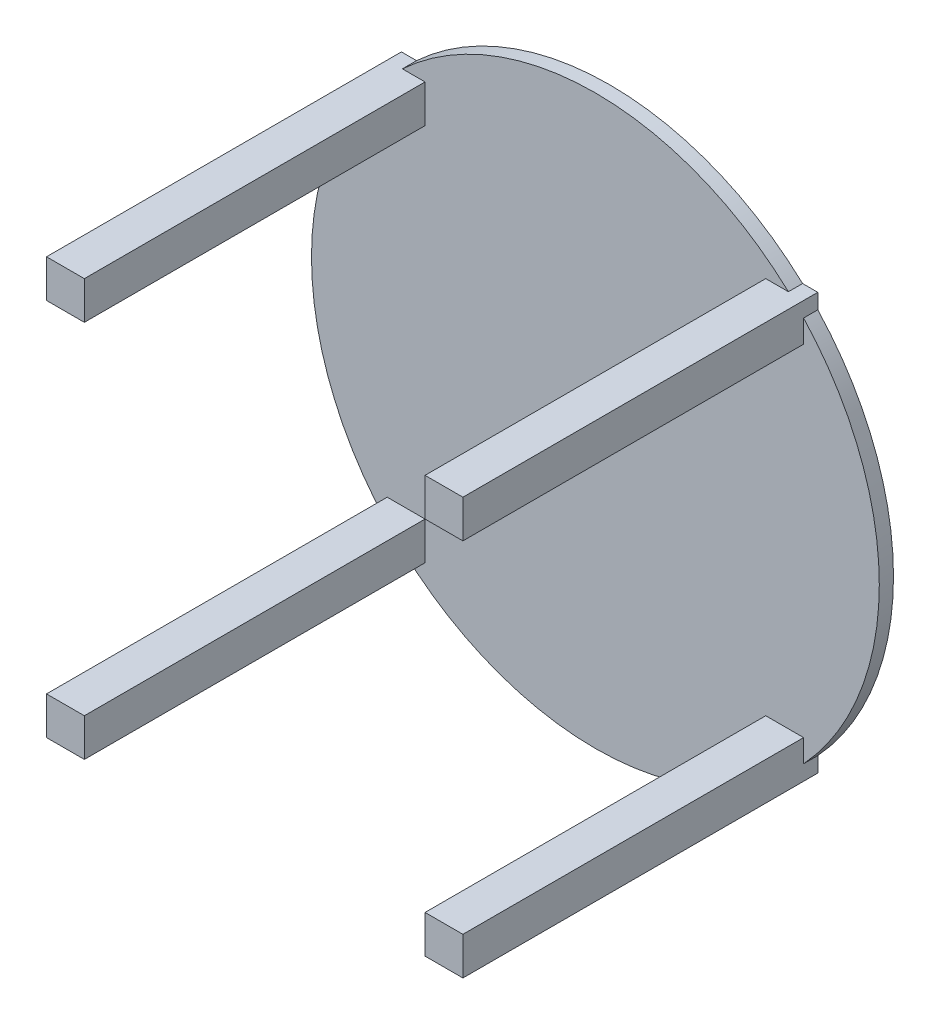
ISO-10303-21;
HEADER;
FILE_DESCRIPTION(('STEP AP214'),'2;1');
FILE_NAME('part.step','',(''),(''),'','','');
FILE_SCHEMA(('AUTOMOTIVE_DESIGN { 1 0 10303 214 1 1 1 1 }'));
ENDSEC;
DATA;
#1=APPLICATION_CONTEXT('core data for automotive mechanical design processes');
#2=APPLICATION_PROTOCOL_DEFINITION('international standard','automotive_design',2000,#1);
#3=PRODUCT_CONTEXT('',#1,'mechanical');
#4=PRODUCT('Part','Part','',(#3));
#5=PRODUCT_RELATED_PRODUCT_CATEGORY('part','',(#4));
#6=PRODUCT_DEFINITION_FORMATION('','',#4);
#7=PRODUCT_DEFINITION_CONTEXT('part definition',#1,'design');
#8=PRODUCT_DEFINITION('design','',#6,#7);
#9=PRODUCT_DEFINITION_SHAPE('','',#8);
#10=(LENGTH_UNIT() NAMED_UNIT(*) SI_UNIT(.MILLI.,.METRE.));
#11=(NAMED_UNIT(*) PLANE_ANGLE_UNIT() SI_UNIT($,.RADIAN.));
#12=(NAMED_UNIT(*) SI_UNIT($,.STERADIAN.) SOLID_ANGLE_UNIT());
#13=UNCERTAINTY_MEASURE_WITH_UNIT(LENGTH_MEASURE(1.E-05),#10,'distance_accuracy_value','');
#14=(GEOMETRIC_REPRESENTATION_CONTEXT(3) GLOBAL_UNCERTAINTY_ASSIGNED_CONTEXT((#13)) GLOBAL_UNIT_ASSIGNED_CONTEXT((#10,
#11,#12)) REPRESENTATION_CONTEXT('',''));
#15=CARTESIAN_POINT('',(0.,0.,0.));
#16=DIRECTION('',(0.,0.,1.));
#17=DIRECTION('',(1.,0.,0.));
#18=AXIS2_PLACEMENT_3D('',#15,#16,#17);
#19=CARTESIAN_POINT('',(0.,0.,30.));
#20=DIRECTION('',(0.,0.,-1.));
#21=DIRECTION('',(-1.,0.,0.));
#22=AXIS2_PLACEMENT_3D('',#19,#20,#21);
#23=CYLINDRICAL_SURFACE('',#22,600.);
#24=DIRECTION('',(0.,0.,-1.));
#25=VECTOR('',#24,1.);
#26=CARTESIAN_POINT('',(440.,407.921561087423,30.));
#27=LINE('',#26,#25);
#28=CARTESIAN_POINT('',(440.,407.921561087423,30.));
#29=VERTEX_POINT('',#28);
#30=CARTESIAN_POINT('',(440.,407.921561087423,0.));
#31=VERTEX_POINT('',#30);
#32=EDGE_CURVE('E247',#29,#31,#27,.T.);
#33=ORIENTED_EDGE('',*,*,#32,.F.);
#34=CARTESIAN_POINT('',(0.,0.,30.));
#35=DIRECTION('',(0.,0.,1.));
#36=DIRECTION('',(1.,0.,0.));
#37=AXIS2_PLACEMENT_3D('',#34,#35,#36);
#38=CIRCLE('',#37,600.);
#39=CARTESIAN_POINT('',(440.,-407.921561087423,30.));
#40=VERTEX_POINT('',#39);
#41=EDGE_CURVE('E49',#40,#29,#38,.T.);
#42=ORIENTED_EDGE('',*,*,#41,.F.);
#43=DIRECTION('',(0.,0.,-1.));
#44=VECTOR('',#43,1.);
#45=CARTESIAN_POINT('',(440.,-407.921561087423,30.));
#46=LINE('',#45,#44);
#47=CARTESIAN_POINT('',(440.,-407.921561087423,0.));
#48=VERTEX_POINT('',#47);
#49=EDGE_CURVE('E327',#48,#40,#46,.F.);
#50=ORIENTED_EDGE('',*,*,#49,.F.);
#51=CARTESIAN_POINT('',(0.,0.,0.));
#52=DIRECTION('',(0.,0.,1.));
#53=DIRECTION('',(1.,0.,0.));
#54=AXIS2_PLACEMENT_3D('',#51,#52,#53);
#55=CIRCLE('',#54,600.);
#56=EDGE_CURVE('E373',#48,#31,#55,.T.);
#57=ORIENTED_EDGE('',*,*,#56,.T.);
#58=EDGE_LOOP('',(#33,#42,#50,#57));
#59=FACE_BOUND('',#58,.T.);
#60=ADVANCED_FACE('F41',(#59),#23,.T.);
#61=DIRECTION('',(0.,0.,-1.));
#62=VECTOR('',#61,1.);
#63=CARTESIAN_POINT('',(407.921561087423,440.,30.));
#64=LINE('',#63,#62);
#65=CARTESIAN_POINT('',(407.921561087423,440.,0.));
#66=VERTEX_POINT('',#65);
#67=CARTESIAN_POINT('',(407.921561087423,440.,30.));
#68=VERTEX_POINT('',#67);
#69=EDGE_CURVE('E242',#66,#68,#64,.F.);
#70=ORIENTED_EDGE('',*,*,#69,.F.);
#71=CARTESIAN_POINT('',(-407.921561087423,440.,0.));
#72=VERTEX_POINT('',#71);
#73=EDGE_CURVE('E372',#66,#72,#55,.T.);
#74=ORIENTED_EDGE('',*,*,#73,.T.);
#75=DIRECTION('',(0.,0.,-1.));
#76=VECTOR('',#75,1.);
#77=CARTESIAN_POINT('',(-407.921561087423,440.,30.));
#78=LINE('',#77,#76);
#79=CARTESIAN_POINT('',(-407.921561087423,440.,30.));
#80=VERTEX_POINT('',#79);
#81=EDGE_CURVE('E283',#80,#72,#78,.T.);
#82=ORIENTED_EDGE('',*,*,#81,.F.);
#83=EDGE_CURVE('E50',#68,#80,#38,.T.);
#84=ORIENTED_EDGE('',*,*,#83,.F.);
#85=EDGE_LOOP('',(#70,#74,#82,#84));
#86=FACE_BOUND('',#85,.T.);
#87=ADVANCED_FACE('F412',(#86),#23,.T.);
#88=CARTESIAN_POINT('',(0.,0.,30.));
#89=DIRECTION('',(0.,0.,1.));
#90=DIRECTION('',(1.,0.,0.));
#91=AXIS2_PLACEMENT_3D('',#88,#89,#90);
#92=PLANE('',#91);
#93=ORIENTED_EDGE('',*,*,#41,.T.);
#94=DIRECTION('',(0.,-1.,0.));
#95=VECTOR('',#94,1.);
#96=CARTESIAN_POINT('',(440.,0.,30.));
#97=LINE('',#96,#95);
#98=CARTESIAN_POINT('',(440.,360.,30.));
#99=VERTEX_POINT('',#98);
#100=EDGE_CURVE('E244',#29,#99,#97,.T.);
#101=ORIENTED_EDGE('',*,*,#100,.T.);
#102=DIRECTION('',(-1.,0.,0.));
#103=VECTOR('',#102,1.);
#104=CARTESIAN_POINT('',(0.,360.,30.));
#105=LINE('',#104,#103);
#106=CARTESIAN_POINT('',(360.,360.,30.));
#107=VERTEX_POINT('',#106);
#108=EDGE_CURVE('E229',#99,#107,#105,.T.);
#109=ORIENTED_EDGE('',*,*,#108,.T.);
#110=DIRECTION('',(0.,1.,0.));
#111=VECTOR('',#110,1.);
#112=CARTESIAN_POINT('',(360.,0.,30.));
#113=LINE('',#112,#111);
#114=CARTESIAN_POINT('',(360.,440.,30.));
#115=VERTEX_POINT('',#114);
#116=EDGE_CURVE('E232',#107,#115,#113,.T.);
#117=ORIENTED_EDGE('',*,*,#116,.T.);
#118=DIRECTION('',(1.,0.,0.));
#119=VECTOR('',#118,1.);
#120=CARTESIAN_POINT('',(0.,440.,30.));
#121=LINE('',#120,#119);
#122=EDGE_CURVE('E239',#115,#68,#121,.T.);
#123=ORIENTED_EDGE('',*,*,#122,.T.);
#124=ORIENTED_EDGE('',*,*,#83,.T.);
#125=DIRECTION('',(1.,0.,0.));
#126=VECTOR('',#125,1.);
#127=CARTESIAN_POINT('',(0.,440.,30.));
#128=LINE('',#127,#126);
#129=CARTESIAN_POINT('',(-360.,440.,30.));
#130=VERTEX_POINT('',#129);
#131=EDGE_CURVE('E280',#80,#130,#128,.T.);
#132=ORIENTED_EDGE('',*,*,#131,.T.);
#133=DIRECTION('',(0.,-1.,0.));
#134=VECTOR('',#133,1.);
#135=CARTESIAN_POINT('',(-360.,0.,30.));
#136=LINE('',#135,#134);
#137=CARTESIAN_POINT('',(-360.,360.,30.));
#138=VERTEX_POINT('',#137);
#139=EDGE_CURVE('E286',#130,#138,#136,.T.);
#140=ORIENTED_EDGE('',*,*,#139,.T.);
#141=DIRECTION('',(-1.,0.,0.));
#142=VECTOR('',#141,1.);
#143=CARTESIAN_POINT('',(0.,360.,30.));
#144=LINE('',#143,#142);
#145=CARTESIAN_POINT('',(-440.,360.,30.));
#146=VERTEX_POINT('',#145);
#147=EDGE_CURVE('E272',#138,#146,#144,.T.);
#148=ORIENTED_EDGE('',*,*,#147,.T.);
#149=DIRECTION('',(0.,1.,0.));
#150=VECTOR('',#149,1.);
#151=CARTESIAN_POINT('',(-440.,0.,30.));
#152=LINE('',#151,#150);
#153=CARTESIAN_POINT('',(-440.,407.921561087423,30.));
#154=VERTEX_POINT('',#153);
#155=EDGE_CURVE('E275',#146,#154,#152,.T.);
#156=ORIENTED_EDGE('',*,*,#155,.T.);
#157=CARTESIAN_POINT('',(-440.,-407.921561087423,30.));
#158=VERTEX_POINT('',#157);
#159=EDGE_CURVE('E384',#154,#158,#38,.T.);
#160=ORIENTED_EDGE('',*,*,#159,.T.);
#161=DIRECTION('',(0.,1.,0.));
#162=VECTOR('',#161,1.);
#163=CARTESIAN_POINT('',(-440.,0.,30.));
#164=LINE('',#163,#162);
#165=CARTESIAN_POINT('',(-440.,-360.,30.));
#166=VERTEX_POINT('',#165);
#167=EDGE_CURVE('E359',#158,#166,#164,.T.);
#168=ORIENTED_EDGE('',*,*,#167,.T.);
#169=DIRECTION('',(1.,0.,0.));
#170=VECTOR('',#169,1.);
#171=CARTESIAN_POINT('',(0.,-360.,30.));
#172=LINE('',#171,#170);
#173=CARTESIAN_POINT('',(-360.,-360.,30.));
#174=VERTEX_POINT('',#173);
#175=EDGE_CURVE('E365',#166,#174,#172,.T.);
#176=ORIENTED_EDGE('',*,*,#175,.T.);
#177=DIRECTION('',(0.,-1.,0.));
#178=VECTOR('',#177,1.);
#179=CARTESIAN_POINT('',(-360.,0.,30.));
#180=LINE('',#179,#178);
#181=CARTESIAN_POINT('',(-360.,-440.,30.));
#182=VERTEX_POINT('',#181);
#183=EDGE_CURVE('E368',#174,#182,#180,.T.);
#184=ORIENTED_EDGE('',*,*,#183,.T.);
#185=DIRECTION('',(-1.,0.,0.));
#186=VECTOR('',#185,1.);
#187=CARTESIAN_POINT('',(0.,-440.,30.));
#188=LINE('',#187,#186);
#189=CARTESIAN_POINT('',(-407.921561087423,-440.,30.));
#190=VERTEX_POINT('',#189);
#191=EDGE_CURVE('E354',#182,#190,#188,.T.);
#192=ORIENTED_EDGE('',*,*,#191,.T.);
#193=CARTESIAN_POINT('',(407.921561087423,-440.,30.));
#194=VERTEX_POINT('',#193);
#195=EDGE_CURVE('E11',#190,#194,#38,.T.);
#196=ORIENTED_EDGE('',*,*,#195,.T.);
#197=DIRECTION('',(-1.,0.,0.));
#198=VECTOR('',#197,1.);
#199=CARTESIAN_POINT('',(0.,-440.,30.));
#200=LINE('',#199,#198);
#201=CARTESIAN_POINT('',(360.,-440.,30.));
#202=VERTEX_POINT('',#201);
#203=EDGE_CURVE('E313',#194,#202,#200,.T.);
#204=ORIENTED_EDGE('',*,*,#203,.T.);
#205=DIRECTION('',(0.,1.,0.));
#206=VECTOR('',#205,1.);
#207=CARTESIAN_POINT('',(360.,0.,30.));
#208=LINE('',#207,#206);
#209=CARTESIAN_POINT('',(360.,-360.,30.));
#210=VERTEX_POINT('',#209);
#211=EDGE_CURVE('E318',#202,#210,#208,.T.);
#212=ORIENTED_EDGE('',*,*,#211,.T.);
#213=DIRECTION('',(1.,0.,0.));
#214=VECTOR('',#213,1.);
#215=CARTESIAN_POINT('',(0.,-360.,30.));
#216=LINE('',#215,#214);
#217=CARTESIAN_POINT('',(440.,-360.,30.));
#218=VERTEX_POINT('',#217);
#219=EDGE_CURVE('E321',#210,#218,#216,.T.);
#220=ORIENTED_EDGE('',*,*,#219,.T.);
#221=DIRECTION('',(0.,-1.,0.));
#222=VECTOR('',#221,1.);
#223=CARTESIAN_POINT('',(440.,0.,30.));
#224=LINE('',#223,#222);
#225=EDGE_CURVE('E324',#218,#40,#224,.T.);
#226=ORIENTED_EDGE('',*,*,#225,.T.);
#227=EDGE_LOOP('',(#93,#101,#109,#117,#123,#124,#132,#140,#148,#156,#160,#168,#176,#184,#192,
#196,#204,#212,#220,#226));
#228=FACE_BOUND('',#227,.T.);
#229=ADVANCED_FACE('F393',(#228),#92,.T.);
#230=DIRECTION('',(0.,0.,-1.));
#231=VECTOR('',#230,1.);
#232=CARTESIAN_POINT('',(-440.,407.921561087423,30.));
#233=LINE('',#232,#231);
#234=CARTESIAN_POINT('',(-440.,407.921561087423,0.));
#235=VERTEX_POINT('',#234);
#236=EDGE_CURVE('E278',#235,#154,#233,.F.);
#237=ORIENTED_EDGE('',*,*,#236,.F.);
#238=CARTESIAN_POINT('',(-440.,-407.921561087423,0.));
#239=VERTEX_POINT('',#238);
#240=EDGE_CURVE('E370',#235,#239,#55,.T.);
#241=ORIENTED_EDGE('',*,*,#240,.T.);
#242=DIRECTION('',(0.,0.,-1.));
#243=VECTOR('',#242,1.);
#244=CARTESIAN_POINT('',(-440.,-407.921561087423,30.));
#245=LINE('',#244,#243);
#246=EDGE_CURVE('E362',#158,#239,#245,.T.);
#247=ORIENTED_EDGE('',*,*,#246,.F.);
#248=ORIENTED_EDGE('',*,*,#159,.F.);
#249=EDGE_LOOP('',(#237,#241,#247,#248));
#250=FACE_BOUND('',#249,.T.);
#251=ADVANCED_FACE('F422',(#250),#23,.T.);
#252=DIRECTION('',(0.,0.,-1.));
#253=VECTOR('',#252,1.);
#254=CARTESIAN_POINT('',(407.921561087423,-440.,30.));
#255=LINE('',#254,#253);
#256=CARTESIAN_POINT('',(407.921561087423,-440.,0.));
#257=VERTEX_POINT('',#256);
#258=EDGE_CURVE('E316',#194,#257,#255,.T.);
#259=ORIENTED_EDGE('',*,*,#258,.F.);
#260=ORIENTED_EDGE('',*,*,#195,.F.);
#261=DIRECTION('',(0.,0.,-1.));
#262=VECTOR('',#261,1.);
#263=CARTESIAN_POINT('',(-407.921561087423,-440.,30.));
#264=LINE('',#263,#262);
#265=CARTESIAN_POINT('',(-407.921561087423,-440.,0.));
#266=VERTEX_POINT('',#265);
#267=EDGE_CURVE('E357',#266,#190,#264,.F.);
#268=ORIENTED_EDGE('',*,*,#267,.F.);
#269=EDGE_CURVE('E44',#266,#257,#55,.T.);
#270=ORIENTED_EDGE('',*,*,#269,.T.);
#271=EDGE_LOOP('',(#259,#260,#268,#270));
#272=FACE_BOUND('',#271,.T.);
#273=ADVANCED_FACE('F432',(#272),#23,.T.);
#274=CARTESIAN_POINT('',(0.,0.,0.));
#275=DIRECTION('',(0.,0.,1.));
#276=DIRECTION('',(1.,0.,0.));
#277=AXIS2_PLACEMENT_3D('',#274,#275,#276);
#278=PLANE('',#277);
#279=ORIENTED_EDGE('',*,*,#73,.F.);
#280=DIRECTION('',(-1.,0.,0.));
#281=VECTOR('',#280,1.);
#282=CARTESIAN_POINT('',(360.,440.,0.));
#283=LINE('',#282,#281);
#284=CARTESIAN_POINT('',(440.,440.,0.));
#285=VERTEX_POINT('',#284);
#286=EDGE_CURVE('E223',#285,#66,#283,.T.);
#287=ORIENTED_EDGE('',*,*,#286,.F.);
#288=DIRECTION('',(0.,1.,0.));
#289=VECTOR('',#288,1.);
#290=CARTESIAN_POINT('',(440.,360.,0.));
#291=LINE('',#290,#289);
#292=EDGE_CURVE('E227',#31,#285,#291,.T.);
#293=ORIENTED_EDGE('',*,*,#292,.F.);
#294=ORIENTED_EDGE('',*,*,#56,.F.);
#295=DIRECTION('',(0.,1.,0.));
#296=VECTOR('',#295,1.);
#297=CARTESIAN_POINT('',(440.,-440.,0.));
#298=LINE('',#297,#296);
#299=CARTESIAN_POINT('',(440.,-440.,0.));
#300=VERTEX_POINT('',#299);
#301=EDGE_CURVE('E289',#300,#48,#298,.T.);
#302=ORIENTED_EDGE('',*,*,#301,.F.);
#303=DIRECTION('',(1.,0.,0.));
#304=VECTOR('',#303,1.);
#305=CARTESIAN_POINT('',(360.,-440.,0.));
#306=LINE('',#305,#304);
#307=EDGE_CURVE('E294',#257,#300,#306,.T.);
#308=ORIENTED_EDGE('',*,*,#307,.F.);
#309=ORIENTED_EDGE('',*,*,#269,.F.);
#310=DIRECTION('',(1.,0.,0.));
#311=VECTOR('',#310,1.);
#312=CARTESIAN_POINT('',(-440.,-440.,0.));
#313=LINE('',#312,#311);
#314=CARTESIAN_POINT('',(-440.,-440.,0.));
#315=VERTEX_POINT('',#314);
#316=EDGE_CURVE('E334',#315,#266,#313,.T.);
#317=ORIENTED_EDGE('',*,*,#316,.F.);
#318=DIRECTION('',(0.,-1.,0.));
#319=VECTOR('',#318,1.);
#320=CARTESIAN_POINT('',(-440.,-440.,0.));
#321=LINE('',#320,#319);
#322=EDGE_CURVE('E329',#239,#315,#321,.T.);
#323=ORIENTED_EDGE('',*,*,#322,.F.);
#324=ORIENTED_EDGE('',*,*,#240,.F.);
#325=DIRECTION('',(0.,-1.,0.));
#326=VECTOR('',#325,1.);
#327=CARTESIAN_POINT('',(-440.,360.,0.));
#328=LINE('',#327,#326);
#329=CARTESIAN_POINT('',(-440.,440.,0.));
#330=VERTEX_POINT('',#329);
#331=EDGE_CURVE('E254',#330,#235,#328,.T.);
#332=ORIENTED_EDGE('',*,*,#331,.F.);
#333=DIRECTION('',(-1.,0.,0.));
#334=VECTOR('',#333,1.);
#335=CARTESIAN_POINT('',(-440.,440.,0.));
#336=LINE('',#335,#334);
#337=EDGE_CURVE('E249',#72,#330,#336,.T.);
#338=ORIENTED_EDGE('',*,*,#337,.F.);
#339=EDGE_LOOP('',(#279,#287,#293,#294,#302,#308,#309,#317,#323,#324,#332,#338));
#340=FACE_BOUND('',#339,.T.);
#341=ADVANCED_FACE('F396',(#340),#278,.F.);
#342=CARTESIAN_POINT('',(-440.,-440.,750.));
#343=DIRECTION('',(1.,0.,0.));
#344=DIRECTION('',(0.,0.,-1.));
#345=AXIS2_PLACEMENT_3D('',#342,#343,#344);
#346=PLANE('',#345);
#347=ORIENTED_EDGE('',*,*,#167,.F.);
#348=ORIENTED_EDGE('',*,*,#246,.T.);
#349=ORIENTED_EDGE('',*,*,#322,.T.);
#350=DIRECTION('',(0.,0.,-1.));
#351=VECTOR('',#350,1.);
#352=CARTESIAN_POINT('',(-440.,-440.,750.));
#353=LINE('',#352,#351);
#354=CARTESIAN_POINT('',(-440.,-440.,750.));
#355=VERTEX_POINT('',#354);
#356=EDGE_CURVE('E345',#355,#315,#353,.T.);
#357=ORIENTED_EDGE('',*,*,#356,.F.);
#358=DIRECTION('',(0.,-1.,0.));
#359=VECTOR('',#358,1.);
#360=CARTESIAN_POINT('',(-440.,-440.,750.));
#361=LINE('',#360,#359);
#362=CARTESIAN_POINT('',(-440.,-360.,750.));
#363=VERTEX_POINT('',#362);
#364=EDGE_CURVE('E336',#363,#355,#361,.T.);
#365=ORIENTED_EDGE('',*,*,#364,.F.);
#366=DIRECTION('',(0.,0.,-1.));
#367=VECTOR('',#366,1.);
#368=CARTESIAN_POINT('',(-440.,-360.,750.));
#369=LINE('',#368,#367);
#370=EDGE_CURVE('E348',#363,#166,#369,.T.);
#371=ORIENTED_EDGE('',*,*,#370,.T.);
#372=EDGE_LOOP('',(#347,#348,#349,#357,#365,#371));
#373=FACE_BOUND('',#372,.T.);
#374=ADVANCED_FACE('F424',(#373),#346,.F.);
#375=CARTESIAN_POINT('',(-440.,-440.,750.));
#376=DIRECTION('',(0.,1.,0.));
#377=DIRECTION('',(0.,0.,1.));
#378=AXIS2_PLACEMENT_3D('',#375,#376,#377);
#379=PLANE('',#378);
#380=ORIENTED_EDGE('',*,*,#316,.T.);
#381=ORIENTED_EDGE('',*,*,#267,.T.);
#382=ORIENTED_EDGE('',*,*,#191,.F.);
#383=DIRECTION('',(0.,0.,-1.));
#384=VECTOR('',#383,1.);
#385=CARTESIAN_POINT('',(-360.,-440.,750.));
#386=LINE('',#385,#384);
#387=CARTESIAN_POINT('',(-360.,-440.,750.));
#388=VERTEX_POINT('',#387);
#389=EDGE_CURVE('E340',#388,#182,#386,.T.);
#390=ORIENTED_EDGE('',*,*,#389,.F.);
#391=DIRECTION('',(1.,0.,0.));
#392=VECTOR('',#391,1.);
#393=CARTESIAN_POINT('',(-440.,-440.,750.));
#394=LINE('',#393,#392);
#395=EDGE_CURVE('E338',#355,#388,#394,.T.);
#396=ORIENTED_EDGE('',*,*,#395,.F.);
#397=ORIENTED_EDGE('',*,*,#356,.T.);
#398=EDGE_LOOP('',(#380,#381,#382,#390,#396,#397));
#399=FACE_BOUND('',#398,.T.);
#400=ADVANCED_FACE('F429',(#399),#379,.F.);
#401=CARTESIAN_POINT('',(-360.,-440.,750.));
#402=DIRECTION('',(-1.,0.,0.));
#403=DIRECTION('',(0.,0.,1.));
#404=AXIS2_PLACEMENT_3D('',#401,#402,#403);
#405=PLANE('',#404);
#406=ORIENTED_EDGE('',*,*,#183,.F.);
#407=DIRECTION('',(0.,0.,-1.));
#408=VECTOR('',#407,1.);
#409=CARTESIAN_POINT('',(-360.,-360.,750.));
#410=LINE('',#409,#408);
#411=CARTESIAN_POINT('',(-360.,-360.,750.));
#412=VERTEX_POINT('',#411);
#413=EDGE_CURVE('E351',#412,#174,#410,.T.);
#414=ORIENTED_EDGE('',*,*,#413,.F.);
#415=DIRECTION('',(0.,1.,0.));
#416=VECTOR('',#415,1.);
#417=CARTESIAN_POINT('',(-360.,-440.,750.));
#418=LINE('',#417,#416);
#419=EDGE_CURVE('E330',#388,#412,#418,.T.);
#420=ORIENTED_EDGE('',*,*,#419,.F.);
#421=ORIENTED_EDGE('',*,*,#389,.T.);
#422=EDGE_LOOP('',(#406,#414,#420,#421));
#423=FACE_BOUND('',#422,.T.);
#424=ADVANCED_FACE('F436',(#423),#405,.F.);
#425=CARTESIAN_POINT('',(-440.,-360.,750.));
#426=DIRECTION('',(0.,-1.,0.));
#427=DIRECTION('',(0.,0.,-1.));
#428=AXIS2_PLACEMENT_3D('',#425,#426,#427);
#429=PLANE('',#428);
#430=ORIENTED_EDGE('',*,*,#175,.F.);
#431=ORIENTED_EDGE('',*,*,#370,.F.);
#432=DIRECTION('',(-1.,0.,0.));
#433=VECTOR('',#432,1.);
#434=CARTESIAN_POINT('',(-440.,-360.,750.));
#435=LINE('',#434,#433);
#436=EDGE_CURVE('E333',#412,#363,#435,.T.);
#437=ORIENTED_EDGE('',*,*,#436,.F.);
#438=ORIENTED_EDGE('',*,*,#413,.T.);
#439=EDGE_LOOP('',(#430,#431,#437,#438));
#440=FACE_BOUND('',#439,.T.);
#441=ADVANCED_FACE('F443',(#440),#429,.F.);
#442=CARTESIAN_POINT('',(0.,0.,750.));
#443=DIRECTION('',(0.,0.,-1.));
#444=DIRECTION('',(-1.,0.,0.));
#445=AXIS2_PLACEMENT_3D('',#442,#443,#444);
#446=PLANE('',#445);
#447=ORIENTED_EDGE('',*,*,#419,.T.);
#448=ORIENTED_EDGE('',*,*,#436,.T.);
#449=ORIENTED_EDGE('',*,*,#364,.T.);
#450=ORIENTED_EDGE('',*,*,#395,.T.);
#451=EDGE_LOOP('',(#447,#448,#449,#450));
#452=FACE_BOUND('',#451,.T.);
#453=ADVANCED_FACE('F439',(#452),#446,.F.);
#454=CARTESIAN_POINT('',(440.,-440.,750.));
#455=DIRECTION('',(-1.,0.,0.));
#456=DIRECTION('',(0.,0.,1.));
#457=AXIS2_PLACEMENT_3D('',#454,#455,#456);
#458=PLANE('',#457);
#459=ORIENTED_EDGE('',*,*,#301,.T.);
#460=ORIENTED_EDGE('',*,*,#49,.T.);
#461=ORIENTED_EDGE('',*,*,#225,.F.);
#462=DIRECTION('',(0.,0.,-1.));
#463=VECTOR('',#462,1.);
#464=CARTESIAN_POINT('',(440.,-360.,750.));
#465=LINE('',#464,#463);
#466=CARTESIAN_POINT('',(440.,-360.,750.));
#467=VERTEX_POINT('',#466);
#468=EDGE_CURVE('E310',#467,#218,#465,.T.);
#469=ORIENTED_EDGE('',*,*,#468,.F.);
#470=DIRECTION('',(0.,1.,0.));
#471=VECTOR('',#470,1.);
#472=CARTESIAN_POINT('',(440.,-440.,750.));
#473=LINE('',#472,#471);
#474=CARTESIAN_POINT('',(440.,-440.,750.));
#475=VERTEX_POINT('',#474);
#476=EDGE_CURVE('E290',#475,#467,#473,.T.);
#477=ORIENTED_EDGE('',*,*,#476,.F.);
#478=DIRECTION('',(0.,0.,-1.));
#479=VECTOR('',#478,1.);
#480=CARTESIAN_POINT('',(440.,-440.,750.));
#481=LINE('',#480,#479);
#482=EDGE_CURVE('E300',#475,#300,#481,.T.);
#483=ORIENTED_EDGE('',*,*,#482,.T.);
#484=EDGE_LOOP('',(#459,#460,#461,#469,#477,#483));
#485=FACE_BOUND('',#484,.T.);
#486=ADVANCED_FACE('F450',(#485),#458,.F.);
#487=CARTESIAN_POINT('',(360.,-440.,750.));
#488=DIRECTION('',(0.,1.,0.));
#489=DIRECTION('',(0.,0.,1.));
#490=AXIS2_PLACEMENT_3D('',#487,#488,#489);
#491=PLANE('',#490);
#492=ORIENTED_EDGE('',*,*,#203,.F.);
#493=ORIENTED_EDGE('',*,*,#258,.T.);
#494=ORIENTED_EDGE('',*,*,#307,.T.);
#495=ORIENTED_EDGE('',*,*,#482,.F.);
#496=DIRECTION('',(1.,0.,0.));
#497=VECTOR('',#496,1.);
#498=CARTESIAN_POINT('',(360.,-440.,750.));
#499=LINE('',#498,#497);
#500=CARTESIAN_POINT('',(360.,-440.,750.));
#501=VERTEX_POINT('',#500);
#502=EDGE_CURVE('E298',#501,#475,#499,.T.);
#503=ORIENTED_EDGE('',*,*,#502,.F.);
#504=DIRECTION('',(0.,0.,-1.));
#505=VECTOR('',#504,1.);
#506=CARTESIAN_POINT('',(360.,-440.,750.));
#507=LINE('',#506,#505);
#508=EDGE_CURVE('E305',#501,#202,#507,.T.);
#509=ORIENTED_EDGE('',*,*,#508,.T.);
#510=EDGE_LOOP('',(#492,#493,#494,#495,#503,#509));
#511=FACE_BOUND('',#510,.T.);
#512=ADVANCED_FACE('F597',(#511),#491,.F.);
#513=CARTESIAN_POINT('',(360.,-360.,750.));
#514=DIRECTION('',(0.,-1.,0.));
#515=DIRECTION('',(0.,0.,-1.));
#516=AXIS2_PLACEMENT_3D('',#513,#514,#515);
#517=PLANE('',#516);
#518=ORIENTED_EDGE('',*,*,#219,.F.);
#519=DIRECTION('',(0.,0.,-1.));
#520=VECTOR('',#519,1.);
#521=CARTESIAN_POINT('',(360.,-360.,750.));
#522=LINE('',#521,#520);
#523=CARTESIAN_POINT('',(360.,-360.,750.));
#524=VERTEX_POINT('',#523);
#525=EDGE_CURVE('E307',#524,#210,#522,.T.);
#526=ORIENTED_EDGE('',*,*,#525,.F.);
#527=DIRECTION('',(-1.,0.,0.));
#528=VECTOR('',#527,1.);
#529=CARTESIAN_POINT('',(360.,-360.,750.));
#530=LINE('',#529,#528);
#531=EDGE_CURVE('E293',#467,#524,#530,.T.);
#532=ORIENTED_EDGE('',*,*,#531,.F.);
#533=ORIENTED_EDGE('',*,*,#468,.T.);
#534=EDGE_LOOP('',(#518,#526,#532,#533));
#535=FACE_BOUND('',#534,.T.);
#536=ADVANCED_FACE('F588',(#535),#517,.F.);
#537=CARTESIAN_POINT('',(360.,-440.,750.));
#538=DIRECTION('',(1.,0.,0.));
#539=DIRECTION('',(0.,0.,-1.));
#540=AXIS2_PLACEMENT_3D('',#537,#538,#539);
#541=PLANE('',#540);
#542=ORIENTED_EDGE('',*,*,#211,.F.);
#543=ORIENTED_EDGE('',*,*,#508,.F.);
#544=DIRECTION('',(0.,-1.,0.));
#545=VECTOR('',#544,1.);
#546=CARTESIAN_POINT('',(360.,-440.,750.));
#547=LINE('',#546,#545);
#548=EDGE_CURVE('E296',#524,#501,#547,.T.);
#549=ORIENTED_EDGE('',*,*,#548,.F.);
#550=ORIENTED_EDGE('',*,*,#525,.T.);
#551=EDGE_LOOP('',(#542,#543,#549,#550));
#552=FACE_BOUND('',#551,.T.);
#553=ADVANCED_FACE('F579',(#552),#541,.F.);
#554=CARTESIAN_POINT('',(0.,0.,750.));
#555=DIRECTION('',(0.,0.,-1.));
#556=DIRECTION('',(-1.,0.,0.));
#557=AXIS2_PLACEMENT_3D('',#554,#555,#556);
#558=PLANE('',#557);
#559=ORIENTED_EDGE('',*,*,#476,.T.);
#560=ORIENTED_EDGE('',*,*,#531,.T.);
#561=ORIENTED_EDGE('',*,*,#548,.T.);
#562=ORIENTED_EDGE('',*,*,#502,.T.);
#563=EDGE_LOOP('',(#559,#560,#561,#562));
#564=FACE_BOUND('',#563,.T.);
#565=ADVANCED_FACE('F567',(#564),#558,.F.);
#566=CARTESIAN_POINT('',(-440.,440.,750.));
#567=DIRECTION('',(0.,-1.,0.));
#568=DIRECTION('',(0.,0.,-1.));
#569=AXIS2_PLACEMENT_3D('',#566,#567,#568);
#570=PLANE('',#569);
#571=ORIENTED_EDGE('',*,*,#131,.F.);
#572=ORIENTED_EDGE('',*,*,#81,.T.);
#573=ORIENTED_EDGE('',*,*,#337,.T.);
#574=DIRECTION('',(0.,0.,-1.));
#575=VECTOR('',#574,1.);
#576=CARTESIAN_POINT('',(-440.,440.,750.));
#577=LINE('',#576,#575);
#578=CARTESIAN_POINT('',(-440.,440.,750.));
#579=VERTEX_POINT('',#578);
#580=EDGE_CURVE('E266',#579,#330,#577,.T.);
#581=ORIENTED_EDGE('',*,*,#580,.F.);
#582=DIRECTION('',(-1.,0.,0.));
#583=VECTOR('',#582,1.);
#584=CARTESIAN_POINT('',(-440.,440.,750.));
#585=LINE('',#584,#583);
#586=CARTESIAN_POINT('',(-360.,440.,750.));
#587=VERTEX_POINT('',#586);
#588=EDGE_CURVE('E253',#587,#579,#585,.T.);
#589=ORIENTED_EDGE('',*,*,#588,.F.);
#590=DIRECTION('',(0.,0.,-1.));
#591=VECTOR('',#590,1.);
#592=CARTESIAN_POINT('',(-360.,440.,750.));
#593=LINE('',#592,#591);
#594=EDGE_CURVE('E269',#587,#130,#593,.T.);
#595=ORIENTED_EDGE('',*,*,#594,.T.);
#596=EDGE_LOOP('',(#571,#572,#573,#581,#589,#595));
#597=FACE_BOUND('',#596,.T.);
#598=ADVANCED_FACE('F415',(#597),#570,.F.);
#599=CARTESIAN_POINT('',(-440.,360.,750.));
#600=DIRECTION('',(1.,0.,0.));
#601=DIRECTION('',(0.,0.,-1.));
#602=AXIS2_PLACEMENT_3D('',#599,#600,#601);
#603=PLANE('',#602);
#604=ORIENTED_EDGE('',*,*,#331,.T.);
#605=ORIENTED_EDGE('',*,*,#236,.T.);
#606=ORIENTED_EDGE('',*,*,#155,.F.);
#607=DIRECTION('',(0.,0.,-1.));
#608=VECTOR('',#607,1.);
#609=CARTESIAN_POINT('',(-440.,360.,750.));
#610=LINE('',#609,#608);
#611=CARTESIAN_POINT('',(-440.,360.,750.));
#612=VERTEX_POINT('',#611);
#613=EDGE_CURVE('E65',#612,#146,#610,.T.);
#614=ORIENTED_EDGE('',*,*,#613,.F.);
#615=DIRECTION('',(0.,-1.,0.));
#616=VECTOR('',#615,1.);
#617=CARTESIAN_POINT('',(-440.,360.,750.));
#618=LINE('',#617,#616);
#619=EDGE_CURVE('E256',#579,#612,#618,.T.);
#620=ORIENTED_EDGE('',*,*,#619,.F.);
#621=ORIENTED_EDGE('',*,*,#580,.T.);
#622=EDGE_LOOP('',(#604,#605,#606,#614,#620,#621));
#623=FACE_BOUND('',#622,.T.);
#624=ADVANCED_FACE('F420',(#623),#603,.F.);
#625=CARTESIAN_POINT('',(-360.,360.,750.));
#626=DIRECTION('',(-1.,0.,0.));
#627=DIRECTION('',(0.,0.,1.));
#628=AXIS2_PLACEMENT_3D('',#625,#626,#627);
#629=PLANE('',#628);
#630=ORIENTED_EDGE('',*,*,#139,.F.);
#631=ORIENTED_EDGE('',*,*,#594,.F.);
#632=DIRECTION('',(0.,1.,0.));
#633=VECTOR('',#632,1.);
#634=CARTESIAN_POINT('',(-360.,360.,750.));
#635=LINE('',#634,#633);
#636=CARTESIAN_POINT('',(-360.,360.,750.));
#637=VERTEX_POINT('',#636);
#638=EDGE_CURVE('E250',#637,#587,#635,.T.);
#639=ORIENTED_EDGE('',*,*,#638,.F.);
#640=DIRECTION('',(0.,0.,-1.));
#641=VECTOR('',#640,1.);
#642=CARTESIAN_POINT('',(-360.,360.,750.));
#643=LINE('',#642,#641);
#644=EDGE_CURVE('E260',#637,#138,#643,.T.);
#645=ORIENTED_EDGE('',*,*,#644,.T.);
#646=EDGE_LOOP('',(#630,#631,#639,#645));
#647=FACE_BOUND('',#646,.T.);
#648=ADVANCED_FACE('F546',(#647),#629,.F.);
#649=CARTESIAN_POINT('',(-440.,360.,750.));
#650=DIRECTION('',(0.,1.,0.));
#651=DIRECTION('',(0.,0.,1.));
#652=AXIS2_PLACEMENT_3D('',#649,#650,#651);
#653=PLANE('',#652);
#654=ORIENTED_EDGE('',*,*,#147,.F.);
#655=ORIENTED_EDGE('',*,*,#644,.F.);
#656=DIRECTION('',(1.,0.,0.));
#657=VECTOR('',#656,1.);
#658=CARTESIAN_POINT('',(-440.,360.,750.));
#659=LINE('',#658,#657);
#660=EDGE_CURVE('E258',#612,#637,#659,.T.);
#661=ORIENTED_EDGE('',*,*,#660,.F.);
#662=ORIENTED_EDGE('',*,*,#613,.T.);
#663=EDGE_LOOP('',(#654,#655,#661,#662));
#664=FACE_BOUND('',#663,.T.);
#665=ADVANCED_FACE('F537',(#664),#653,.F.);
#666=CARTESIAN_POINT('',(0.,0.,750.));
#667=DIRECTION('',(0.,0.,-1.));
#668=DIRECTION('',(-1.,0.,0.));
#669=AXIS2_PLACEMENT_3D('',#666,#667,#668);
#670=PLANE('',#669);
#671=ORIENTED_EDGE('',*,*,#638,.T.);
#672=ORIENTED_EDGE('',*,*,#588,.T.);
#673=ORIENTED_EDGE('',*,*,#619,.T.);
#674=ORIENTED_EDGE('',*,*,#660,.T.);
#675=EDGE_LOOP('',(#671,#672,#673,#674));
#676=FACE_BOUND('',#675,.T.);
#677=ADVANCED_FACE('F488',(#676),#670,.F.);
#678=CARTESIAN_POINT('',(440.,360.,750.));
#679=DIRECTION('',(-1.,0.,0.));
#680=DIRECTION('',(0.,0.,1.));
#681=AXIS2_PLACEMENT_3D('',#678,#679,#680);
#682=PLANE('',#681);
#683=ORIENTED_EDGE('',*,*,#100,.F.);
#684=ORIENTED_EDGE('',*,*,#32,.T.);
#685=ORIENTED_EDGE('',*,*,#292,.T.);
#686=DIRECTION('',(0.,0.,-1.));
#687=VECTOR('',#686,1.);
#688=CARTESIAN_POINT('',(440.,440.,750.));
#689=LINE('',#688,#687);
#690=CARTESIAN_POINT('',(440.,440.,750.));
#691=VERTEX_POINT('',#690);
#692=EDGE_CURVE('E209',#691,#285,#689,.T.);
#693=ORIENTED_EDGE('',*,*,#692,.F.);
#694=DIRECTION('',(0.,1.,0.));
#695=VECTOR('',#694,1.);
#696=CARTESIAN_POINT('',(440.,360.,750.));
#697=LINE('',#696,#695);
#698=CARTESIAN_POINT('',(440.,360.,750.));
#699=VERTEX_POINT('',#698);
#700=EDGE_CURVE('E215',#699,#691,#697,.T.);
#701=ORIENTED_EDGE('',*,*,#700,.F.);
#702=DIRECTION('',(0.,0.,-1.));
#703=VECTOR('',#702,1.);
#704=CARTESIAN_POINT('',(440.,360.,750.));
#705=LINE('',#704,#703);
#706=EDGE_CURVE('E403',#699,#99,#705,.T.);
#707=ORIENTED_EDGE('',*,*,#706,.T.);
#708=EDGE_LOOP('',(#683,#684,#685,#693,#701,#707));
#709=FACE_BOUND('',#708,.T.);
#710=ADVANCED_FACE('F225',(#709),#682,.F.);
#711=CARTESIAN_POINT('',(360.,440.,750.));
#712=DIRECTION('',(0.,-1.,0.));
#713=DIRECTION('',(0.,0.,-1.));
#714=AXIS2_PLACEMENT_3D('',#711,#712,#713);
#715=PLANE('',#714);
#716=ORIENTED_EDGE('',*,*,#286,.T.);
#717=ORIENTED_EDGE('',*,*,#69,.T.);
#718=ORIENTED_EDGE('',*,*,#122,.F.);
#719=DIRECTION('',(0.,0.,-1.));
#720=VECTOR('',#719,1.);
#721=CARTESIAN_POINT('',(360.,440.,750.));
#722=LINE('',#721,#720);
#723=CARTESIAN_POINT('',(360.,440.,750.));
#724=VERTEX_POINT('',#723);
#725=EDGE_CURVE('E211',#724,#115,#722,.T.);
#726=ORIENTED_EDGE('',*,*,#725,.F.);
#727=DIRECTION('',(-1.,0.,0.));
#728=VECTOR('',#727,1.);
#729=CARTESIAN_POINT('',(360.,440.,750.));
#730=LINE('',#729,#728);
#731=EDGE_CURVE('E205',#691,#724,#730,.T.);
#732=ORIENTED_EDGE('',*,*,#731,.F.);
#733=ORIENTED_EDGE('',*,*,#692,.T.);
#734=EDGE_LOOP('',(#716,#717,#718,#726,#732,#733));
#735=FACE_BOUND('',#734,.T.);
#736=ADVANCED_FACE('F207',(#735),#715,.F.);
#737=CARTESIAN_POINT('',(360.,360.,750.));
#738=DIRECTION('',(1.,0.,0.));
#739=DIRECTION('',(0.,0.,-1.));
#740=AXIS2_PLACEMENT_3D('',#737,#738,#739);
#741=PLANE('',#740);
#742=ORIENTED_EDGE('',*,*,#116,.F.);
#743=DIRECTION('',(0.,0.,-1.));
#744=VECTOR('',#743,1.);
#745=CARTESIAN_POINT('',(360.,360.,750.));
#746=LINE('',#745,#744);
#747=CARTESIAN_POINT('',(360.,360.,750.));
#748=VERTEX_POINT('',#747);
#749=EDGE_CURVE('E57',#748,#107,#746,.T.);
#750=ORIENTED_EDGE('',*,*,#749,.F.);
#751=DIRECTION('',(0.,-1.,0.));
#752=VECTOR('',#751,1.);
#753=CARTESIAN_POINT('',(360.,360.,750.));
#754=LINE('',#753,#752);
#755=EDGE_CURVE('E214',#724,#748,#754,.T.);
#756=ORIENTED_EDGE('',*,*,#755,.F.);
#757=ORIENTED_EDGE('',*,*,#725,.T.);
#758=EDGE_LOOP('',(#742,#750,#756,#757));
#759=FACE_BOUND('',#758,.T.);
#760=ADVANCED_FACE('F405',(#759),#741,.F.);
#761=CARTESIAN_POINT('',(360.,360.,750.));
#762=DIRECTION('',(0.,1.,0.));
#763=DIRECTION('',(0.,0.,1.));
#764=AXIS2_PLACEMENT_3D('',#761,#762,#763);
#765=PLANE('',#764);
#766=ORIENTED_EDGE('',*,*,#108,.F.);
#767=ORIENTED_EDGE('',*,*,#706,.F.);
#768=DIRECTION('',(1.,0.,0.));
#769=VECTOR('',#768,1.);
#770=CARTESIAN_POINT('',(360.,360.,750.));
#771=LINE('',#770,#769);
#772=EDGE_CURVE('E219',#748,#699,#771,.T.);
#773=ORIENTED_EDGE('',*,*,#772,.F.);
#774=ORIENTED_EDGE('',*,*,#749,.T.);
#775=EDGE_LOOP('',(#766,#767,#773,#774));
#776=FACE_BOUND('',#775,.T.);
#777=ADVANCED_FACE('F406',(#776),#765,.F.);
#778=CARTESIAN_POINT('',(0.,0.,750.));
#779=DIRECTION('',(0.,0.,-1.));
#780=DIRECTION('',(-1.,0.,0.));
#781=AXIS2_PLACEMENT_3D('',#778,#779,#780);
#782=PLANE('',#781);
#783=ORIENTED_EDGE('',*,*,#700,.T.);
#784=ORIENTED_EDGE('',*,*,#731,.T.);
#785=ORIENTED_EDGE('',*,*,#755,.T.);
#786=ORIENTED_EDGE('',*,*,#772,.T.);
#787=EDGE_LOOP('',(#783,#784,#785,#786));
#788=FACE_BOUND('',#787,.T.);
#789=ADVANCED_FACE('F218',(#788),#782,.F.);
#790=CLOSED_SHELL('',(#60,#87,#229,#251,#273,#341,#374,#400,#424,#441,#453,#486,#512,#536,#553,
#565,#598,#624,#648,#665,#677,#710,#736,#760,#777,#789));
#791=MANIFOLD_SOLID_BREP('B2',#790);
#792=ADVANCED_BREP_SHAPE_REPRESENTATION('',(#18,#791),#14);
#793=SHAPE_DEFINITION_REPRESENTATION(#9,#792);
ENDSEC;
END-ISO-10303-21;
